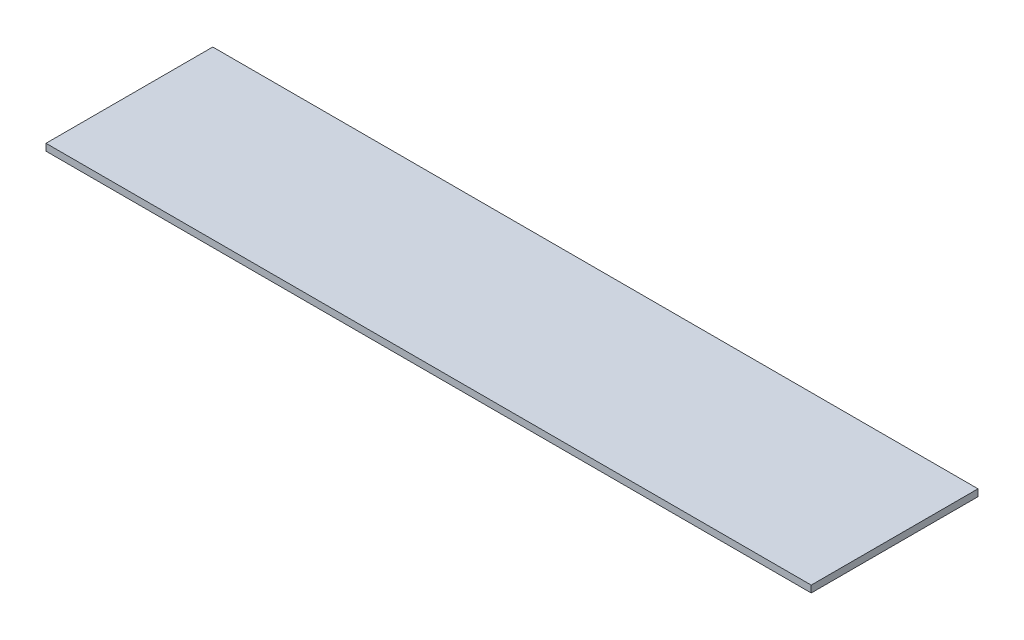
ISO-10303-21;
HEADER;
FILE_DESCRIPTION(('STEP AP214'),'2;1');
FILE_NAME('part.step','',(''),(''),'','','');
FILE_SCHEMA(('AUTOMOTIVE_DESIGN { 1 0 10303 214 1 1 1 1 }'));
ENDSEC;
DATA;
#1=APPLICATION_CONTEXT('core data for automotive mechanical design processes');
#2=APPLICATION_PROTOCOL_DEFINITION('international standard','automotive_design',2000,#1);
#3=PRODUCT_CONTEXT('',#1,'mechanical');
#4=PRODUCT('Part','Part','',(#3));
#5=PRODUCT_RELATED_PRODUCT_CATEGORY('part','',(#4));
#6=PRODUCT_DEFINITION_FORMATION('','',#4);
#7=PRODUCT_DEFINITION_CONTEXT('part definition',#1,'design');
#8=PRODUCT_DEFINITION('design','',#6,#7);
#9=PRODUCT_DEFINITION_SHAPE('','',#8);
#10=(LENGTH_UNIT() NAMED_UNIT(*) SI_UNIT(.MILLI.,.METRE.));
#11=(NAMED_UNIT(*) PLANE_ANGLE_UNIT() SI_UNIT($,.RADIAN.));
#12=(NAMED_UNIT(*) SI_UNIT($,.STERADIAN.) SOLID_ANGLE_UNIT());
#13=UNCERTAINTY_MEASURE_WITH_UNIT(LENGTH_MEASURE(1.E-05),#10,'distance_accuracy_value','');
#14=(GEOMETRIC_REPRESENTATION_CONTEXT(3) GLOBAL_UNCERTAINTY_ASSIGNED_CONTEXT((#13)) GLOBAL_UNIT_ASSIGNED_CONTEXT((#10,
#11,#12)) REPRESENTATION_CONTEXT('',''));
#15=CARTESIAN_POINT('',(0.,0.,0.));
#16=DIRECTION('',(0.,0.,1.));
#17=DIRECTION('',(1.,0.,0.));
#18=AXIS2_PLACEMENT_3D('',#15,#16,#17);
#19=CARTESIAN_POINT('',(-38.616393442623,7.,-9.59016393442623));
#20=DIRECTION('',(1.,0.,0.));
#21=DIRECTION('',(0.,0.,-1.));
#22=AXIS2_PLACEMENT_3D('',#19,#20,#21);
#23=PLANE('',#22);
#24=DIRECTION('',(0.,0.,1.));
#25=VECTOR('',#24,1.);
#26=CARTESIAN_POINT('',(-38.616393442623,0.,-9.59016393442623));
#27=LINE('',#26,#25);
#28=CARTESIAN_POINT('',(-38.616393442623,0.,-9.59016393442623));
#29=VERTEX_POINT('',#28);
#30=CARTESIAN_POINT('',(-38.6163934426229,0.,160.409836065574));
#31=VERTEX_POINT('',#30);
#32=EDGE_CURVE('E113',#29,#31,#27,.T.);
#33=ORIENTED_EDGE('',*,*,#32,.T.);
#34=DIRECTION('',(0.,-1.,0.));
#35=VECTOR('',#34,1.);
#36=CARTESIAN_POINT('',(-38.6163934426229,7.,160.409836065574));
#37=LINE('',#36,#35);
#38=CARTESIAN_POINT('',(-38.6163934426229,7.,160.409836065574));
#39=VERTEX_POINT('',#38);
#40=EDGE_CURVE('E11',#39,#31,#37,.T.);
#41=ORIENTED_EDGE('',*,*,#40,.F.);
#42=DIRECTION('',(0.,0.,1.));
#43=VECTOR('',#42,1.);
#44=CARTESIAN_POINT('',(-38.616393442623,7.,-9.59016393442623));
#45=LINE('',#44,#43);
#46=CARTESIAN_POINT('',(-38.616393442623,7.,-9.59016393442623));
#47=VERTEX_POINT('',#46);
#48=EDGE_CURVE('E97',#47,#39,#45,.T.);
#49=ORIENTED_EDGE('',*,*,#48,.F.);
#50=DIRECTION('',(0.,-1.,0.));
#51=VECTOR('',#50,1.);
#52=CARTESIAN_POINT('',(-38.616393442623,7.,-9.59016393442623));
#53=LINE('',#52,#51);
#54=EDGE_CURVE('E109',#47,#29,#53,.T.);
#55=ORIENTED_EDGE('',*,*,#54,.T.);
#56=EDGE_LOOP('',(#33,#41,#49,#55));
#57=FACE_BOUND('',#56,.T.);
#58=ADVANCED_FACE('F45',(#57),#23,.F.);
#59=CARTESIAN_POINT('',(-38.6163934426229,7.,160.409836065574));
#60=DIRECTION('',(0.,0.,-1.));
#61=DIRECTION('',(-1.,0.,0.));
#62=AXIS2_PLACEMENT_3D('',#59,#60,#61);
#63=PLANE('',#62);
#64=DIRECTION('',(1.,0.,0.));
#65=VECTOR('',#64,1.);
#66=CARTESIAN_POINT('',(-38.6163934426229,0.,160.409836065574));
#67=LINE('',#66,#65);
#68=CARTESIAN_POINT('',(741.383606557377,0.,160.409836065574));
#69=VERTEX_POINT('',#68);
#70=EDGE_CURVE('E102',#31,#69,#67,.T.);
#71=ORIENTED_EDGE('',*,*,#70,.T.);
#72=DIRECTION('',(0.,-1.,0.));
#73=VECTOR('',#72,1.);
#74=CARTESIAN_POINT('',(741.383606557377,7.,160.409836065574));
#75=LINE('',#74,#73);
#76=CARTESIAN_POINT('',(741.383606557377,7.,160.409836065574));
#77=VERTEX_POINT('',#76);
#78=EDGE_CURVE('E54',#77,#69,#75,.T.);
#79=ORIENTED_EDGE('',*,*,#78,.F.);
#80=DIRECTION('',(1.,0.,0.));
#81=VECTOR('',#80,1.);
#82=CARTESIAN_POINT('',(-38.6163934426229,7.,160.409836065574));
#83=LINE('',#82,#81);
#84=EDGE_CURVE('E92',#39,#77,#83,.T.);
#85=ORIENTED_EDGE('',*,*,#84,.F.);
#86=ORIENTED_EDGE('',*,*,#40,.T.);
#87=EDGE_LOOP('',(#71,#79,#85,#86));
#88=FACE_BOUND('',#87,.T.);
#89=ADVANCED_FACE('F101',(#88),#63,.F.);
#90=CARTESIAN_POINT('',(741.383606557377,7.,-9.59016393442623));
#91=DIRECTION('',(-1.,0.,0.));
#92=DIRECTION('',(0.,0.,1.));
#93=AXIS2_PLACEMENT_3D('',#90,#91,#92);
#94=PLANE('',#93);
#95=DIRECTION('',(0.,0.,-1.));
#96=VECTOR('',#95,1.);
#97=CARTESIAN_POINT('',(741.383606557377,0.,-9.59016393442623));
#98=LINE('',#97,#96);
#99=CARTESIAN_POINT('',(741.383606557377,0.,-9.59016393442623));
#100=VERTEX_POINT('',#99);
#101=EDGE_CURVE('E79',#69,#100,#98,.T.);
#102=ORIENTED_EDGE('',*,*,#101,.T.);
#103=DIRECTION('',(0.,-1.,0.));
#104=VECTOR('',#103,1.);
#105=CARTESIAN_POINT('',(741.383606557377,7.,-9.59016393442623));
#106=LINE('',#105,#104);
#107=CARTESIAN_POINT('',(741.383606557377,7.,-9.59016393442623));
#108=VERTEX_POINT('',#107);
#109=EDGE_CURVE('E104',#108,#100,#106,.T.);
#110=ORIENTED_EDGE('',*,*,#109,.F.);
#111=DIRECTION('',(0.,0.,-1.));
#112=VECTOR('',#111,1.);
#113=CARTESIAN_POINT('',(741.383606557377,7.,-9.59016393442623));
#114=LINE('',#113,#112);
#115=EDGE_CURVE('E95',#77,#108,#114,.T.);
#116=ORIENTED_EDGE('',*,*,#115,.F.);
#117=ORIENTED_EDGE('',*,*,#78,.T.);
#118=EDGE_LOOP('',(#102,#110,#116,#117));
#119=FACE_BOUND('',#118,.T.);
#120=ADVANCED_FACE('F105',(#119),#94,.F.);
#121=CARTESIAN_POINT('',(-38.616393442623,7.,-9.59016393442623));
#122=DIRECTION('',(0.,0.,1.));
#123=DIRECTION('',(1.,0.,0.));
#124=AXIS2_PLACEMENT_3D('',#121,#122,#123);
#125=PLANE('',#124);
#126=DIRECTION('',(-1.,0.,0.));
#127=VECTOR('',#126,1.);
#128=CARTESIAN_POINT('',(-38.616393442623,0.,-9.59016393442623));
#129=LINE('',#128,#127);
#130=EDGE_CURVE('E85',#100,#29,#129,.T.);
#131=ORIENTED_EDGE('',*,*,#130,.T.);
#132=ORIENTED_EDGE('',*,*,#54,.F.);
#133=DIRECTION('',(-1.,0.,0.));
#134=VECTOR('',#133,1.);
#135=CARTESIAN_POINT('',(-38.616393442623,7.,-9.59016393442623));
#136=LINE('',#135,#134);
#137=EDGE_CURVE('E62',#108,#47,#136,.T.);
#138=ORIENTED_EDGE('',*,*,#137,.F.);
#139=ORIENTED_EDGE('',*,*,#109,.T.);
#140=EDGE_LOOP('',(#131,#132,#138,#139));
#141=FACE_BOUND('',#140,.T.);
#142=ADVANCED_FACE('F126',(#141),#125,.F.);
#143=CARTESIAN_POINT('',(0.,7.,0.));
#144=DIRECTION('',(0.,1.,0.));
#145=DIRECTION('',(0.,0.,1.));
#146=AXIS2_PLACEMENT_3D('',#143,#144,#145);
#147=PLANE('',#146);
#148=ORIENTED_EDGE('',*,*,#48,.T.);
#149=ORIENTED_EDGE('',*,*,#84,.T.);
#150=ORIENTED_EDGE('',*,*,#115,.T.);
#151=ORIENTED_EDGE('',*,*,#137,.T.);
#152=EDGE_LOOP('',(#148,#149,#150,#151));
#153=FACE_BOUND('',#152,.T.);
#154=ADVANCED_FACE('F93',(#153),#147,.T.);
#155=CARTESIAN_POINT('',(0.,0.,0.));
#156=DIRECTION('',(0.,1.,0.));
#157=DIRECTION('',(0.,0.,1.));
#158=AXIS2_PLACEMENT_3D('',#155,#156,#157);
#159=PLANE('',#158);
#160=ORIENTED_EDGE('',*,*,#32,.F.);
#161=ORIENTED_EDGE('',*,*,#130,.F.);
#162=ORIENTED_EDGE('',*,*,#101,.F.);
#163=ORIENTED_EDGE('',*,*,#70,.F.);
#164=EDGE_LOOP('',(#160,#161,#162,#163));
#165=FACE_BOUND('',#164,.T.);
#166=ADVANCED_FACE('F129',(#165),#159,.F.);
#167=CLOSED_SHELL('',(#58,#89,#120,#142,#154,#166));
#168=MANIFOLD_SOLID_BREP('B2',#167);
#169=ADVANCED_BREP_SHAPE_REPRESENTATION('',(#18,#168),#14);
#170=SHAPE_DEFINITION_REPRESENTATION(#9,#169);
ENDSEC;
END-ISO-10303-21;
